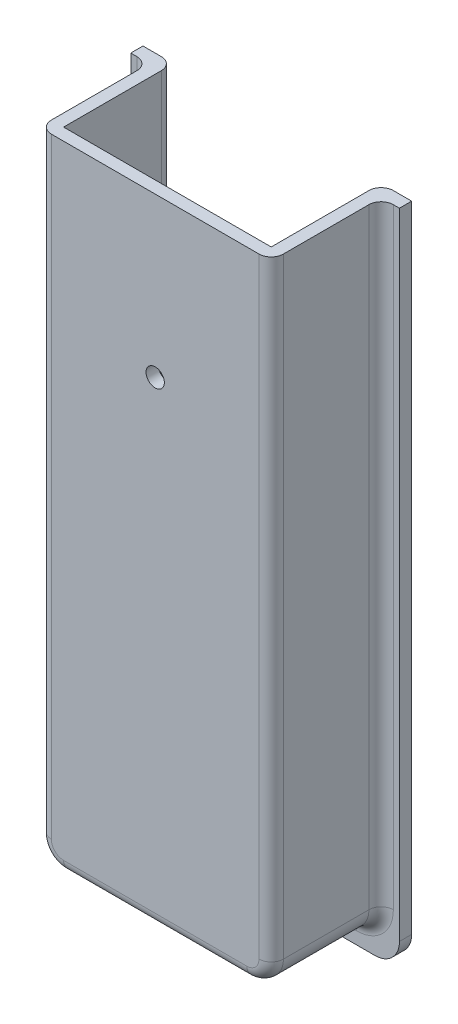
ISO-10303-21;
HEADER;
FILE_DESCRIPTION(('STEP AP214'),'2;1');
FILE_NAME('part.step','',(''),(''),'','','');
FILE_SCHEMA(('AUTOMOTIVE_DESIGN { 1 0 10303 214 1 1 1 1 }'));
ENDSEC;
DATA;
#1=APPLICATION_CONTEXT('core data for automotive mechanical design processes');
#2=APPLICATION_PROTOCOL_DEFINITION('international standard','automotive_design',2000,#1);
#3=PRODUCT_CONTEXT('',#1,'mechanical');
#4=PRODUCT('Part','Part','',(#3));
#5=PRODUCT_RELATED_PRODUCT_CATEGORY('part','',(#4));
#6=PRODUCT_DEFINITION_FORMATION('','',#4);
#7=PRODUCT_DEFINITION_CONTEXT('part definition',#1,'design');
#8=PRODUCT_DEFINITION('design','',#6,#7);
#9=PRODUCT_DEFINITION_SHAPE('','',#8);
#10=(LENGTH_UNIT() NAMED_UNIT(*) SI_UNIT(.MILLI.,.METRE.));
#11=(NAMED_UNIT(*) PLANE_ANGLE_UNIT() SI_UNIT($,.RADIAN.));
#12=(NAMED_UNIT(*) SI_UNIT($,.STERADIAN.) SOLID_ANGLE_UNIT());
#13=UNCERTAINTY_MEASURE_WITH_UNIT(LENGTH_MEASURE(1.E-05),#10,'distance_accuracy_value','');
#14=(GEOMETRIC_REPRESENTATION_CONTEXT(3) GLOBAL_UNCERTAINTY_ASSIGNED_CONTEXT((#13)) GLOBAL_UNIT_ASSIGNED_CONTEXT((#10,
#11,#12)) REPRESENTATION_CONTEXT('',''));
#15=CARTESIAN_POINT('',(0.,0.,0.));
#16=DIRECTION('',(0.,0.,1.));
#17=DIRECTION('',(1.,0.,0.));
#18=AXIS2_PLACEMENT_3D('',#15,#16,#17);
#19=CARTESIAN_POINT('',(0.,0.,20.));
#20=DIRECTION('',(0.,0.,-1.));
#21=DIRECTION('',(-1.,0.,0.));
#22=AXIS2_PLACEMENT_3D('',#19,#20,#21);
#23=PLANE('',#22);
#24=CARTESIAN_POINT('',(17.,76.,20.));
#25=DIRECTION('',(0.,0.,1.));
#26=DIRECTION('',(1.,0.,0.));
#27=AXIS2_PLACEMENT_3D('',#24,#25,#26);
#28=CIRCLE('',#27,1.5);
#29=CARTESIAN_POINT('',(18.5,76.,20.));
#30=VERTEX_POINT('',#29);
#31=EDGE_CURVE('E542',#30,#30,#28,.T.);
#32=ORIENTED_EDGE('',*,*,#31,.F.);
#33=EDGE_LOOP('',(#32));
#34=FACE_BOUND('',#33,.T.);
#35=CARTESIAN_POINT('',(2.,2.,20.));
#36=DIRECTION('',(0.,0.,-1.));
#37=DIRECTION('',(-1.,0.,0.));
#38=AXIS2_PLACEMENT_3D('',#35,#36,#37);
#39=CIRCLE('',#38,2.);
#40=CARTESIAN_POINT('',(2.,0.,20.));
#41=VERTEX_POINT('',#40);
#42=CARTESIAN_POINT('',(0.,2.,20.));
#43=VERTEX_POINT('',#42);
#44=EDGE_CURVE('E297',#41,#43,#39,.T.);
#45=ORIENTED_EDGE('',*,*,#44,.F.);
#46=DIRECTION('',(1.,0.,0.));
#47=VECTOR('',#46,1.);
#48=CARTESIAN_POINT('',(0.,0.,20.));
#49=LINE('',#48,#47);
#50=CARTESIAN_POINT('',(32.,0.,20.));
#51=VERTEX_POINT('',#50);
#52=EDGE_CURVE('E274',#41,#51,#49,.T.);
#53=ORIENTED_EDGE('',*,*,#52,.T.);
#54=CARTESIAN_POINT('',(32.,2.,20.));
#55=DIRECTION('',(0.,0.,-1.));
#56=DIRECTION('',(-1.,0.,0.));
#57=AXIS2_PLACEMENT_3D('',#54,#55,#56);
#58=CIRCLE('',#57,2.);
#59=CARTESIAN_POINT('',(34.,2.,20.));
#60=VERTEX_POINT('',#59);
#61=EDGE_CURVE('E294',#60,#51,#58,.T.);
#62=ORIENTED_EDGE('',*,*,#61,.F.);
#63=DIRECTION('',(0.,1.,0.));
#64=VECTOR('',#63,1.);
#65=CARTESIAN_POINT('',(34.,0.,20.));
#66=LINE('',#65,#64);
#67=CARTESIAN_POINT('',(34.,102.,20.));
#68=VERTEX_POINT('',#67);
#69=EDGE_CURVE('E277',#60,#68,#66,.T.);
#70=ORIENTED_EDGE('',*,*,#69,.T.);
#71=DIRECTION('',(-1.,0.,0.));
#72=VECTOR('',#71,1.);
#73=CARTESIAN_POINT('',(0.,102.,20.));
#74=LINE('',#73,#72);
#75=CARTESIAN_POINT('',(0.,102.,20.));
#76=VERTEX_POINT('',#75);
#77=EDGE_CURVE('E208',#68,#76,#74,.T.);
#78=ORIENTED_EDGE('',*,*,#77,.T.);
#79=DIRECTION('',(0.,-1.,0.));
#80=VECTOR('',#79,1.);
#81=CARTESIAN_POINT('',(0.,0.,20.));
#82=LINE('',#81,#80);
#83=EDGE_CURVE('E269',#76,#43,#82,.T.);
#84=ORIENTED_EDGE('',*,*,#83,.T.);
#85=EDGE_LOOP('',(#45,#53,#62,#70,#78,#84));
#86=FACE_BOUND('',#85,.T.);
#87=ADVANCED_FACE('F35',(#34,#86),#23,.F.);
#88=CARTESIAN_POINT('',(0.,-2.,18.));
#89=DIRECTION('',(0.,1.,0.));
#90=DIRECTION('',(0.,0.,1.));
#91=AXIS2_PLACEMENT_3D('',#88,#89,#90);
#92=PLANE('',#91);
#93=DIRECTION('',(0.,0.,-1.));
#94=VECTOR('',#93,1.);
#95=CARTESIAN_POINT('',(2.,-2.,18.));
#96=LINE('',#95,#94);
#97=CARTESIAN_POINT('',(2.,-2.,18.));
#98=VERTEX_POINT('',#97);
#99=CARTESIAN_POINT('',(2.,-2.,3.99968303363608));
#100=VERTEX_POINT('',#99);
#101=EDGE_CURVE('E308',#98,#100,#96,.T.);
#102=ORIENTED_EDGE('',*,*,#101,.T.);
#103=DIRECTION('',(-1.,0.,0.));
#104=VECTOR('',#103,1.);
#105=CARTESIAN_POINT('',(32.,-2.,3.99968303363608));
#106=LINE('',#105,#104);
#107=CARTESIAN_POINT('',(32.,-2.,3.99968303363608));
#108=VERTEX_POINT('',#107);
#109=EDGE_CURVE('E354',#100,#108,#106,.F.);
#110=ORIENTED_EDGE('',*,*,#109,.T.);
#111=DIRECTION('',(0.,0.,-1.));
#112=VECTOR('',#111,1.);
#113=CARTESIAN_POINT('',(32.,-2.,18.));
#114=LINE('',#113,#112);
#115=CARTESIAN_POINT('',(32.,-2.,18.));
#116=VERTEX_POINT('',#115);
#117=EDGE_CURVE('E311',#108,#116,#114,.F.);
#118=ORIENTED_EDGE('',*,*,#117,.T.);
#119=DIRECTION('',(1.,0.,0.));
#120=VECTOR('',#119,1.);
#121=CARTESIAN_POINT('',(0.,-2.,18.));
#122=LINE('',#121,#120);
#123=EDGE_CURVE('E279',#116,#98,#122,.F.);
#124=ORIENTED_EDGE('',*,*,#123,.T.);
#125=EDGE_LOOP('',(#102,#110,#118,#124));
#126=FACE_BOUND('',#125,.T.);
#127=ADVANCED_FACE('F421',(#126),#92,.F.);
#128=CARTESIAN_POINT('',(36.,0.,18.));
#129=DIRECTION('',(-1.,0.,0.));
#130=DIRECTION('',(0.,0.,1.));
#131=AXIS2_PLACEMENT_3D('',#128,#129,#130);
#132=PLANE('',#131);
#133=DIRECTION('',(0.,0.,-1.));
#134=VECTOR('',#133,1.);
#135=CARTESIAN_POINT('',(36.,2.,18.));
#136=LINE('',#135,#134);
#137=CARTESIAN_POINT('',(36.,2.,18.));
#138=VERTEX_POINT('',#137);
#139=CARTESIAN_POINT('',(36.,2.,3.99968303363608));
#140=VERTEX_POINT('',#139);
#141=EDGE_CURVE('E305',#138,#140,#136,.T.);
#142=ORIENTED_EDGE('',*,*,#141,.T.);
#143=DIRECTION('',(0.,-1.,0.));
#144=VECTOR('',#143,1.);
#145=CARTESIAN_POINT('',(36.,102.,3.99968303363608));
#146=LINE('',#145,#144);
#147=CARTESIAN_POINT('',(36.,102.,3.99968303363608));
#148=VERTEX_POINT('',#147);
#149=EDGE_CURVE('E350',#140,#148,#146,.F.);
#150=ORIENTED_EDGE('',*,*,#149,.T.);
#151=DIRECTION('',(0.,0.,-1.));
#152=VECTOR('',#151,1.);
#153=CARTESIAN_POINT('',(36.,102.,18.));
#154=LINE('',#153,#152);
#155=CARTESIAN_POINT('',(36.,102.,18.));
#156=VERTEX_POINT('',#155);
#157=EDGE_CURVE('E266',#156,#148,#154,.T.);
#158=ORIENTED_EDGE('',*,*,#157,.F.);
#159=DIRECTION('',(0.,1.,0.));
#160=VECTOR('',#159,1.);
#161=CARTESIAN_POINT('',(36.,0.,18.));
#162=LINE('',#161,#160);
#163=EDGE_CURVE('E286',#156,#138,#162,.F.);
#164=ORIENTED_EDGE('',*,*,#163,.T.);
#165=EDGE_LOOP('',(#142,#150,#158,#164));
#166=FACE_BOUND('',#165,.T.);
#167=ADVANCED_FACE('F428',(#166),#132,.F.);
#168=CARTESIAN_POINT('',(-2.,0.,18.));
#169=DIRECTION('',(1.,0.,0.));
#170=DIRECTION('',(0.,0.,-1.));
#171=AXIS2_PLACEMENT_3D('',#168,#169,#170);
#172=PLANE('',#171);
#173=DIRECTION('',(0.,0.,-1.));
#174=VECTOR('',#173,1.);
#175=CARTESIAN_POINT('',(-2.,102.,18.));
#176=LINE('',#175,#174);
#177=CARTESIAN_POINT('',(-2.,102.,18.));
#178=VERTEX_POINT('',#177);
#179=CARTESIAN_POINT('',(-2.,102.,3.99968303363608));
#180=VERTEX_POINT('',#179);
#181=EDGE_CURVE('E263',#178,#180,#176,.T.);
#182=ORIENTED_EDGE('',*,*,#181,.T.);
#183=DIRECTION('',(0.,1.,0.));
#184=VECTOR('',#183,1.);
#185=CARTESIAN_POINT('',(-2.,2.,3.99968303363608));
#186=LINE('',#185,#184);
#187=CARTESIAN_POINT('',(-2.,2.,3.99968303363608));
#188=VERTEX_POINT('',#187);
#189=EDGE_CURVE('E358',#180,#188,#186,.F.);
#190=ORIENTED_EDGE('',*,*,#189,.T.);
#191=DIRECTION('',(0.,0.,-1.));
#192=VECTOR('',#191,1.);
#193=CARTESIAN_POINT('',(-2.,2.,18.));
#194=LINE('',#193,#192);
#195=CARTESIAN_POINT('',(-2.,2.,18.));
#196=VERTEX_POINT('',#195);
#197=EDGE_CURVE('E313',#188,#196,#194,.F.);
#198=ORIENTED_EDGE('',*,*,#197,.T.);
#199=DIRECTION('',(0.,-1.,0.));
#200=VECTOR('',#199,1.);
#201=CARTESIAN_POINT('',(-2.,0.,18.));
#202=LINE('',#201,#200);
#203=EDGE_CURVE('E289',#196,#178,#202,.F.);
#204=ORIENTED_EDGE('',*,*,#203,.T.);
#205=EDGE_LOOP('',(#182,#190,#198,#204));
#206=FACE_BOUND('',#205,.T.);
#207=ADVANCED_FACE('F502',(#206),#172,.F.);
#208=CARTESIAN_POINT('',(0.,0.,0.));
#209=DIRECTION('',(0.,0.,-1.));
#210=DIRECTION('',(-1.,0.,0.));
#211=AXIS2_PLACEMENT_3D('',#208,#209,#210);
#212=PLANE('',#211);
#213=DIRECTION('',(1.,0.,0.));
#214=VECTOR('',#213,1.);
#215=CARTESIAN_POINT('',(0.,-2.,0.));
#216=LINE('',#215,#214);
#217=CARTESIAN_POINT('',(-2.,-2.,0.));
#218=VERTEX_POINT('',#217);
#219=CARTESIAN_POINT('',(36.,-2.,0.));
#220=VERTEX_POINT('',#219);
#221=EDGE_CURVE('E364',#218,#220,#216,.T.);
#222=ORIENTED_EDGE('',*,*,#221,.T.);
#223=DIRECTION('',(0.,1.,0.));
#224=VECTOR('',#223,1.);
#225=CARTESIAN_POINT('',(36.,0.,0.));
#226=LINE('',#225,#224);
#227=CARTESIAN_POINT('',(36.,102.,0.));
#228=VERTEX_POINT('',#227);
#229=EDGE_CURVE('E205',#220,#228,#226,.T.);
#230=ORIENTED_EDGE('',*,*,#229,.T.);
#231=DIRECTION('',(-1.,0.,0.));
#232=VECTOR('',#231,1.);
#233=CARTESIAN_POINT('',(0.,102.,0.));
#234=LINE('',#233,#232);
#235=CARTESIAN_POINT('',(39.,102.,0.));
#236=VERTEX_POINT('',#235);
#237=EDGE_CURVE('E200',#236,#228,#234,.T.);
#238=ORIENTED_EDGE('',*,*,#237,.F.);
#239=DIRECTION('',(0.,-1.,0.));
#240=VECTOR('',#239,1.);
#241=CARTESIAN_POINT('',(39.,102.,0.));
#242=LINE('',#241,#240);
#243=CARTESIAN_POINT('',(39.,-2.00000000000002,0.));
#244=VERTEX_POINT('',#243);
#245=EDGE_CURVE('E203',#236,#244,#242,.T.);
#246=ORIENTED_EDGE('',*,*,#245,.T.);
#247=CARTESIAN_POINT('',(35.,-2.00000000000002,0.));
#248=DIRECTION('',(0.,0.,-1.));
#249=DIRECTION('',(-1.,0.,0.));
#250=AXIS2_PLACEMENT_3D('',#247,#248,#249);
#251=CIRCLE('',#250,4.);
#252=CARTESIAN_POINT('',(35.,-6.00000000000002,0.));
#253=VERTEX_POINT('',#252);
#254=EDGE_CURVE('E326',#244,#253,#251,.T.);
#255=ORIENTED_EDGE('',*,*,#254,.T.);
#256=DIRECTION('',(-1.,0.,0.));
#257=VECTOR('',#256,1.);
#258=CARTESIAN_POINT('',(-5.,-6.00000000000002,0.));
#259=LINE('',#258,#257);
#260=CARTESIAN_POINT('',(-0.999999999999997,-6.00000000000002,0.));
#261=VERTEX_POINT('',#260);
#262=EDGE_CURVE('E231',#253,#261,#259,.T.);
#263=ORIENTED_EDGE('',*,*,#262,.T.);
#264=CARTESIAN_POINT('',(-0.999999999999997,-2.00000000000002,0.));
#265=DIRECTION('',(0.,0.,-1.));
#266=DIRECTION('',(-1.,0.,0.));
#267=AXIS2_PLACEMENT_3D('',#264,#265,#266);
#268=CIRCLE('',#267,4.);
#269=CARTESIAN_POINT('',(-5.,-2.00000000000002,0.));
#270=VERTEX_POINT('',#269);
#271=EDGE_CURVE('E328',#261,#270,#268,.T.);
#272=ORIENTED_EDGE('',*,*,#271,.T.);
#273=DIRECTION('',(0.,1.,0.));
#274=VECTOR('',#273,1.);
#275=CARTESIAN_POINT('',(-5.,-2.,0.));
#276=LINE('',#275,#274);
#277=CARTESIAN_POINT('',(-5.,102.,0.));
#278=VERTEX_POINT('',#277);
#279=EDGE_CURVE('E235',#270,#278,#276,.T.);
#280=ORIENTED_EDGE('',*,*,#279,.T.);
#281=CARTESIAN_POINT('',(-2.,102.,0.));
#282=VERTEX_POINT('',#281);
#283=EDGE_CURVE('E209',#282,#278,#234,.T.);
#284=ORIENTED_EDGE('',*,*,#283,.F.);
#285=DIRECTION('',(0.,-1.,0.));
#286=VECTOR('',#285,1.);
#287=CARTESIAN_POINT('',(-2.,0.,0.));
#288=LINE('',#287,#286);
#289=EDGE_CURVE('E377',#282,#218,#288,.T.);
#290=ORIENTED_EDGE('',*,*,#289,.T.);
#291=EDGE_LOOP('',(#222,#230,#238,#246,#255,#263,#272,#280,#284,#290));
#292=FACE_BOUND('',#291,.T.);
#293=ADVANCED_FACE('F202',(#292),#212,.T.);
#294=CARTESIAN_POINT('',(0.,102.,18.));
#295=DIRECTION('',(0.,-1.,0.));
#296=DIRECTION('',(0.,0.,-1.));
#297=AXIS2_PLACEMENT_3D('',#294,#295,#296);
#298=PLANE('',#297);
#299=ORIENTED_EDGE('',*,*,#237,.T.);
#300=CARTESIAN_POINT('',(36.,102.,2.));
#301=DIRECTION('',(0.,-1.,0.));
#302=DIRECTION('',(0.,0.,-1.));
#303=AXIS2_PLACEMENT_3D('',#300,#301,#302);
#304=CIRCLE('',#303,2.);
#305=CARTESIAN_POINT('',(34.,102.,2.));
#306=VERTEX_POINT('',#305);
#307=EDGE_CURVE('E382',#228,#306,#304,.F.);
#308=ORIENTED_EDGE('',*,*,#307,.T.);
#309=DIRECTION('',(0.,0.,1.));
#310=VECTOR('',#309,1.);
#311=CARTESIAN_POINT('',(34.,102.,18.));
#312=LINE('',#311,#310);
#313=CARTESIAN_POINT('',(34.,102.,18.));
#314=VERTEX_POINT('',#313);
#315=EDGE_CURVE('E249',#306,#314,#312,.T.);
#316=ORIENTED_EDGE('',*,*,#315,.T.);
#317=DIRECTION('',(-1.,0.,0.));
#318=VECTOR('',#317,1.);
#319=CARTESIAN_POINT('',(0.,102.,18.));
#320=LINE('',#319,#318);
#321=CARTESIAN_POINT('',(0.,102.,18.));
#322=VERTEX_POINT('',#321);
#323=EDGE_CURVE('E239',#314,#322,#320,.T.);
#324=ORIENTED_EDGE('',*,*,#323,.T.);
#325=DIRECTION('',(0.,0.,-1.));
#326=VECTOR('',#325,1.);
#327=CARTESIAN_POINT('',(0.,102.,18.));
#328=LINE('',#327,#326);
#329=CARTESIAN_POINT('',(0.,102.,2.));
#330=VERTEX_POINT('',#329);
#331=EDGE_CURVE('E246',#322,#330,#328,.T.);
#332=ORIENTED_EDGE('',*,*,#331,.T.);
#333=CARTESIAN_POINT('',(-2.,102.,2.));
#334=DIRECTION('',(0.,-1.,0.));
#335=DIRECTION('',(0.,0.,-1.));
#336=AXIS2_PLACEMENT_3D('',#333,#334,#335);
#337=CIRCLE('',#336,2.);
#338=EDGE_CURVE('E380',#330,#282,#337,.F.);
#339=ORIENTED_EDGE('',*,*,#338,.T.);
#340=ORIENTED_EDGE('',*,*,#283,.T.);
#341=DIRECTION('',(0.,0.,1.));
#342=VECTOR('',#341,1.);
#343=CARTESIAN_POINT('',(-5.,102.,0.));
#344=LINE('',#343,#342);
#345=CARTESIAN_POINT('',(-5.,102.,1.99968303363608));
#346=VERTEX_POINT('',#345);
#347=EDGE_CURVE('E236',#278,#346,#344,.T.);
#348=ORIENTED_EDGE('',*,*,#347,.T.);
#349=DIRECTION('',(1.,0.,0.));
#350=VECTOR('',#349,1.);
#351=CARTESIAN_POINT('',(-109.019222897669,102.,1.99968303363608));
#352=LINE('',#351,#350);
#353=CARTESIAN_POINT('',(-4.,102.,1.99968303363608));
#354=VERTEX_POINT('',#353);
#355=EDGE_CURVE('E220',#346,#354,#352,.T.);
#356=ORIENTED_EDGE('',*,*,#355,.T.);
#357=CARTESIAN_POINT('',(-4.,102.,3.99968303363608));
#358=DIRECTION('',(0.,-1.,0.));
#359=DIRECTION('',(0.,0.,-1.));
#360=AXIS2_PLACEMENT_3D('',#357,#358,#359);
#361=CIRCLE('',#360,2.);
#362=EDGE_CURVE('E362',#354,#180,#361,.T.);
#363=ORIENTED_EDGE('',*,*,#362,.T.);
#364=ORIENTED_EDGE('',*,*,#181,.F.);
#365=CARTESIAN_POINT('',(0.,102.,18.));
#366=DIRECTION('',(0.,-1.,0.));
#367=DIRECTION('',(0.,0.,-1.));
#368=AXIS2_PLACEMENT_3D('',#365,#366,#367);
#369=CIRCLE('',#368,2.);
#370=EDGE_CURVE('E282',#178,#76,#369,.F.);
#371=ORIENTED_EDGE('',*,*,#370,.T.);
#372=ORIENTED_EDGE('',*,*,#77,.F.);
#373=CARTESIAN_POINT('',(34.,102.,18.));
#374=DIRECTION('',(0.,-1.,0.));
#375=DIRECTION('',(0.,0.,-1.));
#376=AXIS2_PLACEMENT_3D('',#373,#374,#375);
#377=CIRCLE('',#376,2.);
#378=EDGE_CURVE('E284',#68,#156,#377,.F.);
#379=ORIENTED_EDGE('',*,*,#378,.T.);
#380=ORIENTED_EDGE('',*,*,#157,.T.);
#381=CARTESIAN_POINT('',(38.,102.,3.99968303363608));
#382=DIRECTION('',(0.,-1.,0.));
#383=DIRECTION('',(0.,0.,-1.));
#384=AXIS2_PLACEMENT_3D('',#381,#382,#383);
#385=CIRCLE('',#384,2.);
#386=CARTESIAN_POINT('',(38.,102.,1.99968303363608));
#387=VERTEX_POINT('',#386);
#388=EDGE_CURVE('E360',#148,#387,#385,.T.);
#389=ORIENTED_EDGE('',*,*,#388,.T.);
#390=DIRECTION('',(-1.,0.,0.));
#391=VECTOR('',#390,1.);
#392=CARTESIAN_POINT('',(143.019222897669,102.,1.99968303363608));
#393=LINE('',#392,#391);
#394=CARTESIAN_POINT('',(39.,102.,1.99968303363608));
#395=VERTEX_POINT('',#394);
#396=EDGE_CURVE('E224',#395,#387,#393,.T.);
#397=ORIENTED_EDGE('',*,*,#396,.F.);
#398=DIRECTION('',(0.,0.,-1.));
#399=VECTOR('',#398,1.);
#400=CARTESIAN_POINT('',(39.,102.,0.));
#401=LINE('',#400,#399);
#402=EDGE_CURVE('E216',#395,#236,#401,.T.);
#403=ORIENTED_EDGE('',*,*,#402,.T.);
#404=EDGE_LOOP('',(#299,#308,#316,#324,#332,#339,#340,#348,#356,#363,#364,#371,#372,#379,#380,
#389,#397,#403));
#405=FACE_BOUND('',#404,.T.);
#406=ADVANCED_FACE('F222',(#405),#298,.F.);
#407=CARTESIAN_POINT('',(0.,0.,18.));
#408=DIRECTION('',(1.,0.,0.));
#409=DIRECTION('',(0.,0.,-1.));
#410=AXIS2_PLACEMENT_3D('',#407,#408,#409);
#411=PLANE('',#410);
#412=DIRECTION('',(0.,0.,-1.));
#413=VECTOR('',#412,1.);
#414=CARTESIAN_POINT('',(0.,0.,18.));
#415=LINE('',#414,#413);
#416=CARTESIAN_POINT('',(0.,0.,18.));
#417=VERTEX_POINT('',#416);
#418=CARTESIAN_POINT('',(0.,0.,2.));
#419=VERTEX_POINT('',#418);
#420=EDGE_CURVE('E261',#417,#419,#415,.T.);
#421=ORIENTED_EDGE('',*,*,#420,.T.);
#422=DIRECTION('',(0.,-1.,0.));
#423=VECTOR('',#422,1.);
#424=CARTESIAN_POINT('',(0.,0.,2.));
#425=LINE('',#424,#423);
#426=EDGE_CURVE('E44',#419,#330,#425,.F.);
#427=ORIENTED_EDGE('',*,*,#426,.T.);
#428=ORIENTED_EDGE('',*,*,#331,.F.);
#429=DIRECTION('',(0.,-1.,0.));
#430=VECTOR('',#429,1.);
#431=CARTESIAN_POINT('',(0.,0.,18.));
#432=LINE('',#431,#430);
#433=EDGE_CURVE('E251',#322,#417,#432,.T.);
#434=ORIENTED_EDGE('',*,*,#433,.T.);
#435=EDGE_LOOP('',(#421,#427,#428,#434));
#436=FACE_BOUND('',#435,.T.);
#437=ADVANCED_FACE('F400',(#436),#411,.T.);
#438=CARTESIAN_POINT('',(0.,0.,18.));
#439=DIRECTION('',(0.,1.,0.));
#440=DIRECTION('',(0.,0.,1.));
#441=AXIS2_PLACEMENT_3D('',#438,#439,#440);
#442=PLANE('',#441);
#443=DIRECTION('',(0.,0.,-1.));
#444=VECTOR('',#443,1.);
#445=CARTESIAN_POINT('',(34.,0.,18.));
#446=LINE('',#445,#444);
#447=CARTESIAN_POINT('',(34.,0.,18.));
#448=VERTEX_POINT('',#447);
#449=CARTESIAN_POINT('',(34.,0.,2.));
#450=VERTEX_POINT('',#449);
#451=EDGE_CURVE('E259',#448,#450,#446,.T.);
#452=ORIENTED_EDGE('',*,*,#451,.T.);
#453=DIRECTION('',(1.,0.,0.));
#454=VECTOR('',#453,1.);
#455=CARTESIAN_POINT('',(0.,0.,2.));
#456=LINE('',#455,#454);
#457=EDGE_CURVE('E11',#450,#419,#456,.F.);
#458=ORIENTED_EDGE('',*,*,#457,.T.);
#459=ORIENTED_EDGE('',*,*,#420,.F.);
#460=DIRECTION('',(1.,0.,0.));
#461=VECTOR('',#460,1.);
#462=CARTESIAN_POINT('',(0.,0.,18.));
#463=LINE('',#462,#461);
#464=EDGE_CURVE('E254',#417,#448,#463,.T.);
#465=ORIENTED_EDGE('',*,*,#464,.T.);
#466=EDGE_LOOP('',(#452,#458,#459,#465));
#467=FACE_BOUND('',#466,.T.);
#468=ADVANCED_FACE('F406',(#467),#442,.T.);
#469=CARTESIAN_POINT('',(34.,0.,18.));
#470=DIRECTION('',(-1.,0.,0.));
#471=DIRECTION('',(0.,0.,1.));
#472=AXIS2_PLACEMENT_3D('',#469,#470,#471);
#473=PLANE('',#472);
#474=ORIENTED_EDGE('',*,*,#315,.F.);
#475=DIRECTION('',(0.,1.,0.));
#476=VECTOR('',#475,1.);
#477=CARTESIAN_POINT('',(34.,0.,2.));
#478=LINE('',#477,#476);
#479=EDGE_CURVE('E58',#306,#450,#478,.F.);
#480=ORIENTED_EDGE('',*,*,#479,.T.);
#481=ORIENTED_EDGE('',*,*,#451,.F.);
#482=DIRECTION('',(0.,1.,0.));
#483=VECTOR('',#482,1.);
#484=CARTESIAN_POINT('',(34.,0.,18.));
#485=LINE('',#484,#483);
#486=EDGE_CURVE('E256',#448,#314,#485,.T.);
#487=ORIENTED_EDGE('',*,*,#486,.T.);
#488=EDGE_LOOP('',(#474,#480,#481,#487));
#489=FACE_BOUND('',#488,.T.);
#490=ADVANCED_FACE('F407',(#489),#473,.T.);
#491=CARTESIAN_POINT('',(0.,0.,18.));
#492=DIRECTION('',(0.,0.,-1.));
#493=DIRECTION('',(-1.,0.,0.));
#494=AXIS2_PLACEMENT_3D('',#491,#492,#493);
#495=PLANE('',#494);
#496=CARTESIAN_POINT('',(17.,76.,18.));
#497=DIRECTION('',(0.,0.,-1.));
#498=DIRECTION('',(-1.,0.,0.));
#499=AXIS2_PLACEMENT_3D('',#496,#497,#498);
#500=CIRCLE('',#499,1.5);
#501=CARTESIAN_POINT('',(15.5,76.,18.));
#502=VERTEX_POINT('',#501);
#503=EDGE_CURVE('E39',#502,#502,#500,.T.);
#504=ORIENTED_EDGE('',*,*,#503,.F.);
#505=EDGE_LOOP('',(#504));
#506=FACE_BOUND('',#505,.T.);
#507=ORIENTED_EDGE('',*,*,#433,.F.);
#508=ORIENTED_EDGE('',*,*,#323,.F.);
#509=ORIENTED_EDGE('',*,*,#486,.F.);
#510=ORIENTED_EDGE('',*,*,#464,.F.);
#511=EDGE_LOOP('',(#507,#508,#509,#510));
#512=FACE_BOUND('',#511,.T.);
#513=ADVANCED_FACE('F405',(#506,#512),#495,.T.);
#514=CARTESIAN_POINT('',(0.,0.,18.));
#515=DIRECTION('',(0.,-1.,0.));
#516=DIRECTION('',(0.,0.,-1.));
#517=AXIS2_PLACEMENT_3D('',#514,#515,#516);
#518=CYLINDRICAL_SURFACE('',#517,2.);
#519=ORIENTED_EDGE('',*,*,#203,.F.);
#520=CARTESIAN_POINT('',(0.,2.,18.));
#521=DIRECTION('',(0.,1.,0.));
#522=DIRECTION('',(0.,0.,1.));
#523=AXIS2_PLACEMENT_3D('',#520,#521,#522);
#524=CIRCLE('',#523,2.);
#525=EDGE_CURVE('E291',#196,#43,#524,.T.);
#526=ORIENTED_EDGE('',*,*,#525,.T.);
#527=ORIENTED_EDGE('',*,*,#83,.F.);
#528=ORIENTED_EDGE('',*,*,#370,.F.);
#529=EDGE_LOOP('',(#519,#526,#527,#528));
#530=FACE_BOUND('',#529,.T.);
#531=ADVANCED_FACE('F444',(#530),#518,.T.);
#532=CARTESIAN_POINT('',(34.,0.,18.));
#533=DIRECTION('',(0.,1.,0.));
#534=DIRECTION('',(0.,0.,1.));
#535=AXIS2_PLACEMENT_3D('',#532,#533,#534);
#536=CYLINDRICAL_SURFACE('',#535,2.);
#537=ORIENTED_EDGE('',*,*,#69,.F.);
#538=CARTESIAN_POINT('',(34.,2.,18.));
#539=DIRECTION('',(0.,1.,0.));
#540=DIRECTION('',(0.,0.,1.));
#541=AXIS2_PLACEMENT_3D('',#538,#539,#540);
#542=CIRCLE('',#541,2.);
#543=EDGE_CURVE('E303',#60,#138,#542,.T.);
#544=ORIENTED_EDGE('',*,*,#543,.T.);
#545=ORIENTED_EDGE('',*,*,#163,.F.);
#546=ORIENTED_EDGE('',*,*,#378,.F.);
#547=EDGE_LOOP('',(#537,#544,#545,#546));
#548=FACE_BOUND('',#547,.T.);
#549=ADVANCED_FACE('F440',(#548),#536,.T.);
#550=CARTESIAN_POINT('',(0.,0.,18.));
#551=DIRECTION('',(1.,0.,0.));
#552=DIRECTION('',(0.,0.,-1.));
#553=AXIS2_PLACEMENT_3D('',#550,#551,#552);
#554=CYLINDRICAL_SURFACE('',#553,2.);
#555=ORIENTED_EDGE('',*,*,#123,.F.);
#556=CARTESIAN_POINT('',(32.,0.,18.));
#557=DIRECTION('',(-1.,0.,0.));
#558=DIRECTION('',(0.,0.,1.));
#559=AXIS2_PLACEMENT_3D('',#556,#557,#558);
#560=CIRCLE('',#559,2.);
#561=EDGE_CURVE('E301',#116,#51,#560,.T.);
#562=ORIENTED_EDGE('',*,*,#561,.T.);
#563=ORIENTED_EDGE('',*,*,#52,.F.);
#564=CARTESIAN_POINT('',(2.,0.,18.));
#565=DIRECTION('',(1.,0.,0.));
#566=DIRECTION('',(0.,0.,-1.));
#567=AXIS2_PLACEMENT_3D('',#564,#565,#566);
#568=CIRCLE('',#567,2.);
#569=EDGE_CURVE('E299',#41,#98,#568,.T.);
#570=ORIENTED_EDGE('',*,*,#569,.T.);
#571=EDGE_LOOP('',(#555,#562,#563,#570));
#572=FACE_BOUND('',#571,.T.);
#573=ADVANCED_FACE('F436',(#572),#554,.T.);
#574=CARTESIAN_POINT('',(-109.019222897669,-2.,1.99968303363608));
#575=DIRECTION('',(0.,0.,-1.));
#576=DIRECTION('',(-1.,0.,0.));
#577=AXIS2_PLACEMENT_3D('',#574,#575,#576);
#578=PLANE('',#577);
#579=ORIENTED_EDGE('',*,*,#396,.T.);
#580=DIRECTION('',(0.,-1.,0.));
#581=VECTOR('',#580,1.);
#582=CARTESIAN_POINT('',(38.,2.,1.99968303363608));
#583=LINE('',#582,#581);
#584=CARTESIAN_POINT('',(38.,2.,1.99968303363608));
#585=VERTEX_POINT('',#584);
#586=EDGE_CURVE('E347',#387,#585,#583,.T.);
#587=ORIENTED_EDGE('',*,*,#586,.T.);
#588=CARTESIAN_POINT('',(32.,2.,1.99968303363608));
#589=DIRECTION('',(0.,0.,-1.));
#590=DIRECTION('',(-1.,0.,0.));
#591=AXIS2_PLACEMENT_3D('',#588,#589,#590);
#592=CIRCLE('',#591,6.);
#593=CARTESIAN_POINT('',(32.,-4.,1.99968303363608));
#594=VERTEX_POINT('',#593);
#595=EDGE_CURVE('E345',#585,#594,#592,.T.);
#596=ORIENTED_EDGE('',*,*,#595,.T.);
#597=DIRECTION('',(-1.,0.,0.));
#598=VECTOR('',#597,1.);
#599=CARTESIAN_POINT('',(2.,-4.,1.99968303363608));
#600=LINE('',#599,#598);
#601=CARTESIAN_POINT('',(2.,-4.,1.99968303363608));
#602=VERTEX_POINT('',#601);
#603=EDGE_CURVE('E343',#594,#602,#600,.T.);
#604=ORIENTED_EDGE('',*,*,#603,.T.);
#605=CARTESIAN_POINT('',(2.,2.,1.99968303363608));
#606=DIRECTION('',(0.,0.,-1.));
#607=DIRECTION('',(-1.,0.,0.));
#608=AXIS2_PLACEMENT_3D('',#605,#606,#607);
#609=CIRCLE('',#608,6.);
#610=CARTESIAN_POINT('',(-4.,2.,1.99968303363608));
#611=VERTEX_POINT('',#610);
#612=EDGE_CURVE('E341',#602,#611,#609,.T.);
#613=ORIENTED_EDGE('',*,*,#612,.T.);
#614=DIRECTION('',(0.,1.,0.));
#615=VECTOR('',#614,1.);
#616=CARTESIAN_POINT('',(-4.,102.,1.99968303363608));
#617=LINE('',#616,#615);
#618=EDGE_CURVE('E331',#611,#354,#617,.T.);
#619=ORIENTED_EDGE('',*,*,#618,.T.);
#620=ORIENTED_EDGE('',*,*,#355,.F.);
#621=DIRECTION('',(0.,-1.,0.));
#622=VECTOR('',#621,1.);
#623=CARTESIAN_POINT('',(-5.,-2.,1.99968303363608));
#624=LINE('',#623,#622);
#625=CARTESIAN_POINT('',(-5.,-2.00000000000002,1.99968303363608));
#626=VERTEX_POINT('',#625);
#627=EDGE_CURVE('E232',#346,#626,#624,.T.);
#628=ORIENTED_EDGE('',*,*,#627,.T.);
#629=CARTESIAN_POINT('',(-0.999999999999997,-2.00000000000002,1.99968303363607));
#630=DIRECTION('',(0.,0.,-1.));
#631=DIRECTION('',(-1.,0.,0.));
#632=AXIS2_PLACEMENT_3D('',#629,#630,#631);
#633=CIRCLE('',#632,4.);
#634=CARTESIAN_POINT('',(-0.999999999999997,-6.00000000000002,1.99968303363608));
#635=VERTEX_POINT('',#634);
#636=EDGE_CURVE('E320',#626,#635,#633,.F.);
#637=ORIENTED_EDGE('',*,*,#636,.T.);
#638=DIRECTION('',(1.,0.,0.));
#639=VECTOR('',#638,1.);
#640=CARTESIAN_POINT('',(-5.,-6.00000000000002,1.99968303363608));
#641=LINE('',#640,#639);
#642=CARTESIAN_POINT('',(35.,-6.00000000000002,1.99968303363608));
#643=VERTEX_POINT('',#642);
#644=EDGE_CURVE('E335',#635,#643,#641,.T.);
#645=ORIENTED_EDGE('',*,*,#644,.T.);
#646=CARTESIAN_POINT('',(35.,-2.00000000000002,1.99968303363608));
#647=DIRECTION('',(0.,0.,-1.));
#648=DIRECTION('',(-1.,0.,0.));
#649=AXIS2_PLACEMENT_3D('',#646,#647,#648);
#650=CIRCLE('',#649,4.);
#651=CARTESIAN_POINT('',(39.,-2.00000000000002,1.99968303363608));
#652=VERTEX_POINT('',#651);
#653=EDGE_CURVE('E318',#643,#652,#650,.F.);
#654=ORIENTED_EDGE('',*,*,#653,.T.);
#655=DIRECTION('',(0.,1.,0.));
#656=VECTOR('',#655,1.);
#657=CARTESIAN_POINT('',(39.,102.,1.99968303363608));
#658=LINE('',#657,#656);
#659=EDGE_CURVE('E225',#652,#395,#658,.T.);
#660=ORIENTED_EDGE('',*,*,#659,.T.);
#661=EDGE_LOOP('',(#579,#587,#596,#604,#613,#619,#620,#628,#637,#645,#654,#660));
#662=FACE_BOUND('',#661,.T.);
#663=ADVANCED_FACE('F439',(#662),#578,.F.);
#664=CARTESIAN_POINT('',(-5.,-2.00000000000002,-3.));
#665=DIRECTION('',(1.,0.,0.));
#666=DIRECTION('',(0.,0.,-1.));
#667=AXIS2_PLACEMENT_3D('',#664,#665,#666);
#668=PLANE('',#667);
#669=ORIENTED_EDGE('',*,*,#279,.F.);
#670=DIRECTION('',(0.,0.,1.));
#671=VECTOR('',#670,1.);
#672=CARTESIAN_POINT('',(-5.,-2.00000000000002,-3.));
#673=LINE('',#672,#671);
#674=EDGE_CURVE('E315',#270,#626,#673,.T.);
#675=ORIENTED_EDGE('',*,*,#674,.T.);
#676=ORIENTED_EDGE('',*,*,#627,.F.);
#677=ORIENTED_EDGE('',*,*,#347,.F.);
#678=EDGE_LOOP('',(#669,#675,#676,#677));
#679=FACE_BOUND('',#678,.T.);
#680=ADVANCED_FACE('F588',(#679),#668,.F.);
#681=CARTESIAN_POINT('',(39.,-2.00000000000002,-3.));
#682=DIRECTION('',(-1.,0.,0.));
#683=DIRECTION('',(0.,0.,1.));
#684=AXIS2_PLACEMENT_3D('',#681,#682,#683);
#685=PLANE('',#684);
#686=ORIENTED_EDGE('',*,*,#659,.F.);
#687=DIRECTION('',(0.,0.,-1.));
#688=VECTOR('',#687,1.);
#689=CARTESIAN_POINT('',(39.,-2.00000000000002,-3.));
#690=LINE('',#689,#688);
#691=EDGE_CURVE('E219',#652,#244,#690,.T.);
#692=ORIENTED_EDGE('',*,*,#691,.T.);
#693=ORIENTED_EDGE('',*,*,#245,.F.);
#694=ORIENTED_EDGE('',*,*,#402,.F.);
#695=EDGE_LOOP('',(#686,#692,#693,#694));
#696=FACE_BOUND('',#695,.T.);
#697=ADVANCED_FACE('F215',(#696),#685,.F.);
#698=CARTESIAN_POINT('',(39.,-6.00000000000002,-3.));
#699=DIRECTION('',(0.,1.,0.));
#700=DIRECTION('',(0.,0.,-1.));
#701=AXIS2_PLACEMENT_3D('',#698,#699,#700);
#702=PLANE('',#701);
#703=ORIENTED_EDGE('',*,*,#644,.F.);
#704=DIRECTION('',(0.,0.,1.));
#705=VECTOR('',#704,1.);
#706=CARTESIAN_POINT('',(-0.999999999999994,-6.00000000000002,-3.));
#707=LINE('',#706,#705);
#708=EDGE_CURVE('E324',#635,#261,#707,.F.);
#709=ORIENTED_EDGE('',*,*,#708,.T.);
#710=ORIENTED_EDGE('',*,*,#262,.F.);
#711=DIRECTION('',(0.,0.,-1.));
#712=VECTOR('',#711,1.);
#713=CARTESIAN_POINT('',(35.,-6.00000000000002,-3.));
#714=LINE('',#713,#712);
#715=EDGE_CURVE('E322',#253,#643,#714,.F.);
#716=ORIENTED_EDGE('',*,*,#715,.T.);
#717=EDGE_LOOP('',(#703,#709,#710,#716));
#718=FACE_BOUND('',#717,.T.);
#719=ADVANCED_FACE('F457',(#718),#702,.F.);
#720=CARTESIAN_POINT('',(2.,2.,18.));
#721=DIRECTION('',(0.,0.,-1.));
#722=DIRECTION('',(-1.,0.,0.));
#723=AXIS2_PLACEMENT_3D('',#720,#721,#722);
#724=CYLINDRICAL_SURFACE('',#723,4.);
#725=ORIENTED_EDGE('',*,*,#197,.F.);
#726=CARTESIAN_POINT('',(2.,2.,3.99968303363608));
#727=DIRECTION('',(0.,0.,-1.));
#728=DIRECTION('',(-1.,0.,0.));
#729=AXIS2_PLACEMENT_3D('',#726,#727,#728);
#730=CIRCLE('',#729,4.);
#731=EDGE_CURVE('E356',#188,#100,#730,.F.);
#732=ORIENTED_EDGE('',*,*,#731,.T.);
#733=ORIENTED_EDGE('',*,*,#101,.F.);
#734=CARTESIAN_POINT('',(2.,2.,18.));
#735=DIRECTION('',(0.,0.,-1.));
#736=DIRECTION('',(-1.,0.,0.));
#737=AXIS2_PLACEMENT_3D('',#734,#735,#736);
#738=CIRCLE('',#737,4.);
#739=EDGE_CURVE('E332',#196,#98,#738,.F.);
#740=ORIENTED_EDGE('',*,*,#739,.F.);
#741=EDGE_LOOP('',(#725,#732,#733,#740));
#742=FACE_BOUND('',#741,.T.);
#743=ADVANCED_FACE('F453',(#742),#724,.T.);
#744=CARTESIAN_POINT('',(2.,2.,18.));
#745=DIRECTION('',(0.,0.,-1.));
#746=DIRECTION('',(-1.,0.,0.));
#747=AXIS2_PLACEMENT_3D('',#744,#745,#746);
#748=DEGENERATE_TOROIDAL_SURFACE('',#747,2.,2.,.T.);
#749=ORIENTED_EDGE('',*,*,#525,.F.);
#750=ORIENTED_EDGE('',*,*,#739,.T.);
#751=ORIENTED_EDGE('',*,*,#569,.F.);
#752=ORIENTED_EDGE('',*,*,#44,.T.);
#753=EDGE_LOOP('',(#749,#750,#751,#752));
#754=FACE_BOUND('',#753,.T.);
#755=ADVANCED_FACE('F449',(#754),#748,.T.);
#756=CARTESIAN_POINT('',(32.,2.,18.));
#757=DIRECTION('',(0.,0.,-1.));
#758=DIRECTION('',(-1.,0.,0.));
#759=AXIS2_PLACEMENT_3D('',#756,#757,#758);
#760=CYLINDRICAL_SURFACE('',#759,4.);
#761=ORIENTED_EDGE('',*,*,#117,.F.);
#762=CARTESIAN_POINT('',(32.,2.,3.99968303363608));
#763=DIRECTION('',(0.,0.,-1.));
#764=DIRECTION('',(-1.,0.,0.));
#765=AXIS2_PLACEMENT_3D('',#762,#763,#764);
#766=CIRCLE('',#765,4.);
#767=EDGE_CURVE('E352',#108,#140,#766,.F.);
#768=ORIENTED_EDGE('',*,*,#767,.T.);
#769=ORIENTED_EDGE('',*,*,#141,.F.);
#770=CARTESIAN_POINT('',(32.,2.,18.));
#771=DIRECTION('',(0.,0.,-1.));
#772=DIRECTION('',(-1.,0.,0.));
#773=AXIS2_PLACEMENT_3D('',#770,#771,#772);
#774=CIRCLE('',#773,4.);
#775=EDGE_CURVE('E336',#116,#138,#774,.F.);
#776=ORIENTED_EDGE('',*,*,#775,.F.);
#777=EDGE_LOOP('',(#761,#768,#769,#776));
#778=FACE_BOUND('',#777,.T.);
#779=ADVANCED_FACE('F452',(#778),#760,.T.);
#780=CARTESIAN_POINT('',(32.,2.,18.));
#781=DIRECTION('',(0.,0.,-1.));
#782=DIRECTION('',(-1.,0.,0.));
#783=AXIS2_PLACEMENT_3D('',#780,#781,#782);
#784=DEGENERATE_TOROIDAL_SURFACE('',#783,2.,2.,.T.);
#785=ORIENTED_EDGE('',*,*,#543,.F.);
#786=ORIENTED_EDGE('',*,*,#61,.T.);
#787=ORIENTED_EDGE('',*,*,#561,.F.);
#788=ORIENTED_EDGE('',*,*,#775,.T.);
#789=EDGE_LOOP('',(#785,#786,#787,#788));
#790=FACE_BOUND('',#789,.T.);
#791=ADVANCED_FACE('F459',(#790),#784,.T.);
#792=CARTESIAN_POINT('',(-0.999999999999997,-2.00000000000002,-3.));
#793=DIRECTION('',(0.,0.,1.));
#794=DIRECTION('',(1.,0.,0.));
#795=AXIS2_PLACEMENT_3D('',#792,#793,#794);
#796=CYLINDRICAL_SURFACE('',#795,4.);
#797=ORIENTED_EDGE('',*,*,#271,.F.);
#798=ORIENTED_EDGE('',*,*,#708,.F.);
#799=ORIENTED_EDGE('',*,*,#636,.F.);
#800=ORIENTED_EDGE('',*,*,#674,.F.);
#801=EDGE_LOOP('',(#797,#798,#799,#800));
#802=FACE_BOUND('',#801,.T.);
#803=ADVANCED_FACE('F462',(#802),#796,.T.);
#804=CARTESIAN_POINT('',(35.,-2.00000000000002,-3.));
#805=DIRECTION('',(0.,0.,-1.));
#806=DIRECTION('',(-1.,0.,0.));
#807=AXIS2_PLACEMENT_3D('',#804,#805,#806);
#808=CYLINDRICAL_SURFACE('',#807,4.);
#809=ORIENTED_EDGE('',*,*,#653,.F.);
#810=ORIENTED_EDGE('',*,*,#715,.F.);
#811=ORIENTED_EDGE('',*,*,#254,.F.);
#812=ORIENTED_EDGE('',*,*,#691,.F.);
#813=EDGE_LOOP('',(#809,#810,#811,#812));
#814=FACE_BOUND('',#813,.T.);
#815=ADVANCED_FACE('F469',(#814),#808,.T.);
#816=CARTESIAN_POINT('',(-4.,-2.,3.99968303363608));
#817=DIRECTION('',(0.,-1.,0.));
#818=DIRECTION('',(0.,0.,-1.));
#819=AXIS2_PLACEMENT_3D('',#816,#817,#818);
#820=CYLINDRICAL_SURFACE('',#819,2.);
#821=ORIENTED_EDGE('',*,*,#362,.F.);
#822=ORIENTED_EDGE('',*,*,#618,.F.);
#823=CARTESIAN_POINT('',(-4.,2.,3.99968303363608));
#824=DIRECTION('',(0.,1.,0.));
#825=DIRECTION('',(0.,0.,1.));
#826=AXIS2_PLACEMENT_3D('',#823,#824,#825);
#827=CIRCLE('',#826,2.);
#828=EDGE_CURVE('E339',#188,#611,#827,.T.);
#829=ORIENTED_EDGE('',*,*,#828,.F.);
#830=ORIENTED_EDGE('',*,*,#189,.F.);
#831=EDGE_LOOP('',(#821,#822,#829,#830));
#832=FACE_BOUND('',#831,.T.);
#833=ADVANCED_FACE('F473',(#832),#820,.F.);
#834=CARTESIAN_POINT('',(2.,2.,3.99968303363608));
#835=DIRECTION('',(0.,0.,-1.));
#836=DIRECTION('',(-1.,0.,0.));
#837=AXIS2_PLACEMENT_3D('',#834,#835,#836);
#838=TOROIDAL_SURFACE('',#837,6.,2.);
#839=ORIENTED_EDGE('',*,*,#828,.T.);
#840=ORIENTED_EDGE('',*,*,#612,.F.);
#841=CARTESIAN_POINT('',(2.,-4.,3.99968303363608));
#842=DIRECTION('',(-1.,0.,0.));
#843=DIRECTION('',(0.,0.,1.));
#844=AXIS2_PLACEMENT_3D('',#841,#842,#843);
#845=CIRCLE('',#844,2.);
#846=EDGE_CURVE('E371',#100,#602,#845,.T.);
#847=ORIENTED_EDGE('',*,*,#846,.F.);
#848=ORIENTED_EDGE('',*,*,#731,.F.);
#849=EDGE_LOOP('',(#839,#840,#847,#848));
#850=FACE_BOUND('',#849,.T.);
#851=ADVANCED_FACE('F486',(#850),#838,.F.);
#852=CARTESIAN_POINT('',(-109.019222897669,-4.,3.99968303363608));
#853=DIRECTION('',(1.,0.,0.));
#854=DIRECTION('',(0.,0.,-1.));
#855=AXIS2_PLACEMENT_3D('',#852,#853,#854);
#856=CYLINDRICAL_SURFACE('',#855,2.);
#857=ORIENTED_EDGE('',*,*,#846,.T.);
#858=ORIENTED_EDGE('',*,*,#603,.F.);
#859=CARTESIAN_POINT('',(32.,-4.,3.99968303363608));
#860=DIRECTION('',(-1.,0.,0.));
#861=DIRECTION('',(0.,0.,1.));
#862=AXIS2_PLACEMENT_3D('',#859,#860,#861);
#863=CIRCLE('',#862,2.);
#864=EDGE_CURVE('E367',#108,#594,#863,.T.);
#865=ORIENTED_EDGE('',*,*,#864,.F.);
#866=ORIENTED_EDGE('',*,*,#109,.F.);
#867=EDGE_LOOP('',(#857,#858,#865,#866));
#868=FACE_BOUND('',#867,.T.);
#869=ADVANCED_FACE('F482',(#868),#856,.F.);
#870=CARTESIAN_POINT('',(32.,2.,3.99968303363608));
#871=DIRECTION('',(0.,0.,-1.));
#872=DIRECTION('',(-1.,0.,0.));
#873=AXIS2_PLACEMENT_3D('',#870,#871,#872);
#874=TOROIDAL_SURFACE('',#873,6.,2.);
#875=ORIENTED_EDGE('',*,*,#864,.T.);
#876=ORIENTED_EDGE('',*,*,#595,.F.);
#877=CARTESIAN_POINT('',(38.,2.,3.99968303363608));
#878=DIRECTION('',(0.,-1.,0.));
#879=DIRECTION('',(0.,0.,-1.));
#880=AXIS2_PLACEMENT_3D('',#877,#878,#879);
#881=CIRCLE('',#880,2.);
#882=EDGE_CURVE('E365',#140,#585,#881,.T.);
#883=ORIENTED_EDGE('',*,*,#882,.F.);
#884=ORIENTED_EDGE('',*,*,#767,.F.);
#885=EDGE_LOOP('',(#875,#876,#883,#884));
#886=FACE_BOUND('',#885,.T.);
#887=ADVANCED_FACE('F478',(#886),#874,.F.);
#888=CARTESIAN_POINT('',(38.,-2.,3.99968303363608));
#889=DIRECTION('',(0.,1.,0.));
#890=DIRECTION('',(0.,0.,1.));
#891=AXIS2_PLACEMENT_3D('',#888,#889,#890);
#892=CYLINDRICAL_SURFACE('',#891,2.);
#893=ORIENTED_EDGE('',*,*,#388,.F.);
#894=ORIENTED_EDGE('',*,*,#149,.F.);
#895=ORIENTED_EDGE('',*,*,#882,.T.);
#896=ORIENTED_EDGE('',*,*,#586,.F.);
#897=EDGE_LOOP('',(#893,#894,#895,#896));
#898=FACE_BOUND('',#897,.T.);
#899=ADVANCED_FACE('F475',(#898),#892,.F.);
#900=CARTESIAN_POINT('',(-2.,0.,2.));
#901=DIRECTION('',(0.,-1.,0.));
#902=DIRECTION('',(0.,0.,-1.));
#903=AXIS2_PLACEMENT_3D('',#900,#901,#902);
#904=CYLINDRICAL_SURFACE('',#903,2.);
#905=ORIENTED_EDGE('',*,*,#338,.F.);
#906=ORIENTED_EDGE('',*,*,#426,.F.);
#907=CARTESIAN_POINT('',(-2.,-2.,2.));
#908=DIRECTION('',(0.707106781186547,-0.707106781186547,0.));
#909=DIRECTION('',(-0.707106781186547,-0.707106781186547,0.));
#910=AXIS2_PLACEMENT_3D('',#907,#908,#909);
#911=ELLIPSE('',#910,2.82842712474619,2.);
#912=EDGE_CURVE('E368',#218,#419,#911,.T.);
#913=ORIENTED_EDGE('',*,*,#912,.F.);
#914=ORIENTED_EDGE('',*,*,#289,.F.);
#915=EDGE_LOOP('',(#905,#906,#913,#914));
#916=FACE_BOUND('',#915,.T.);
#917=ADVANCED_FACE('F37',(#916),#904,.T.);
#918=CARTESIAN_POINT('',(0.,-2.,2.));
#919=DIRECTION('',(1.,0.,0.));
#920=DIRECTION('',(0.,0.,-1.));
#921=AXIS2_PLACEMENT_3D('',#918,#919,#920);
#922=CYLINDRICAL_SURFACE('',#921,2.);
#923=ORIENTED_EDGE('',*,*,#912,.T.);
#924=ORIENTED_EDGE('',*,*,#457,.F.);
#925=CARTESIAN_POINT('',(36.,-2.,2.));
#926=DIRECTION('',(0.707106781186547,0.707106781186547,0.));
#927=DIRECTION('',(-0.707106781186547,0.707106781186547,0.));
#928=AXIS2_PLACEMENT_3D('',#925,#926,#927);
#929=ELLIPSE('',#928,2.82842712474619,2.);
#930=EDGE_CURVE('E386',#220,#450,#929,.T.);
#931=ORIENTED_EDGE('',*,*,#930,.F.);
#932=ORIENTED_EDGE('',*,*,#221,.F.);
#933=EDGE_LOOP('',(#923,#924,#931,#932));
#934=FACE_BOUND('',#933,.T.);
#935=ADVANCED_FACE('F392',(#934),#922,.T.);
#936=CARTESIAN_POINT('',(36.,0.,2.));
#937=DIRECTION('',(0.,1.,0.));
#938=DIRECTION('',(0.,0.,1.));
#939=AXIS2_PLACEMENT_3D('',#936,#937,#938);
#940=CYLINDRICAL_SURFACE('',#939,2.);
#941=ORIENTED_EDGE('',*,*,#930,.T.);
#942=ORIENTED_EDGE('',*,*,#479,.F.);
#943=ORIENTED_EDGE('',*,*,#307,.F.);
#944=ORIENTED_EDGE('',*,*,#229,.F.);
#945=EDGE_LOOP('',(#941,#942,#943,#944));
#946=FACE_BOUND('',#945,.T.);
#947=ADVANCED_FACE('F409',(#946),#940,.T.);
#948=CARTESIAN_POINT('',(17.,76.,10.));
#949=DIRECTION('',(0.,0.,1.));
#950=DIRECTION('',(1.,0.,0.));
#951=AXIS2_PLACEMENT_3D('',#948,#949,#950);
#952=CYLINDRICAL_SURFACE('',#951,1.5);
#953=ORIENTED_EDGE('',*,*,#503,.T.);
#954=EDGE_LOOP('',(#953));
#955=FACE_BOUND('',#954,.T.);
#956=ORIENTED_EDGE('',*,*,#31,.T.);
#957=EDGE_LOOP('',(#956));
#958=FACE_BOUND('',#957,.T.);
#959=ADVANCED_FACE('F411',(#955,#958),#952,.F.);
#960=CLOSED_SHELL('',(#87,#127,#167,#207,#293,#406,#437,#468,#490,#513,#531,#549,#573,#663,#680,
#697,#719,#743,#755,#779,#791,#803,#815,#833,#851,#869,#887,#899,#917,#935,#947,#959));
#961=MANIFOLD_SOLID_BREP('B2',#960);
#962=ADVANCED_BREP_SHAPE_REPRESENTATION('',(#18,#961),#14);
#963=SHAPE_DEFINITION_REPRESENTATION(#9,#962);
ENDSEC;
END-ISO-10303-21;
